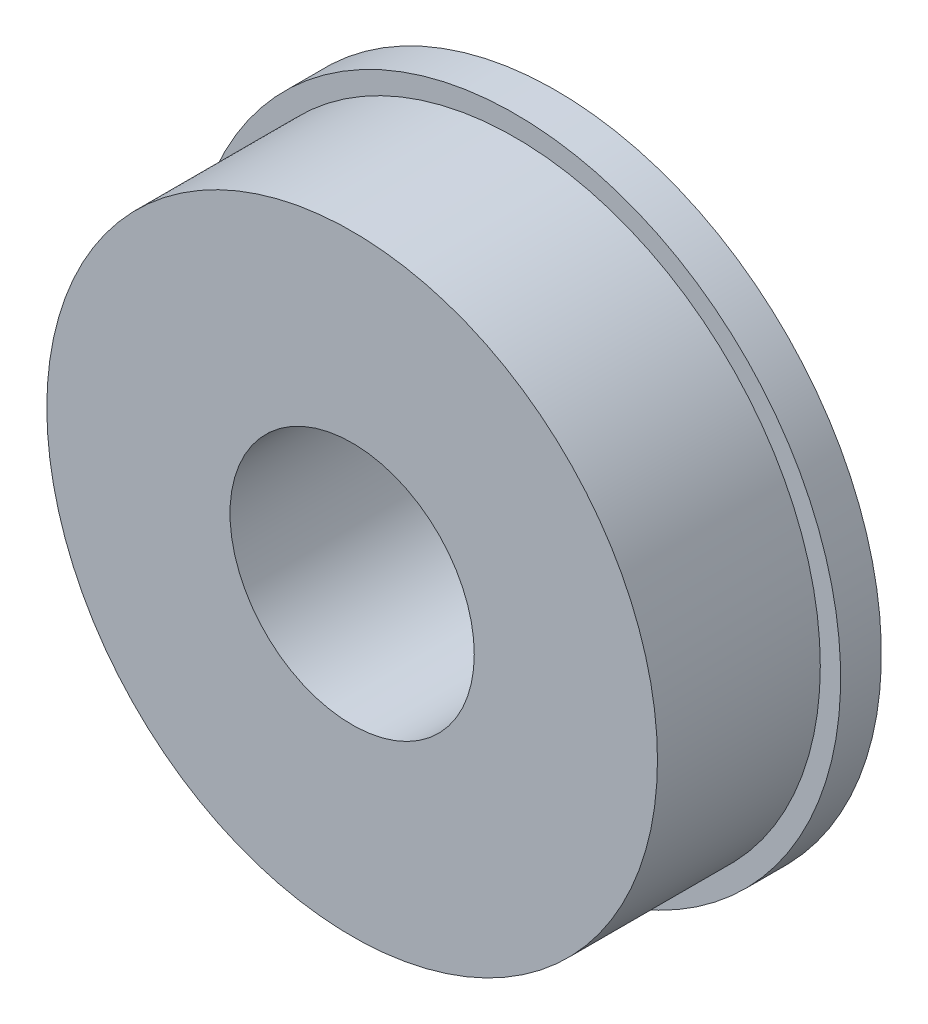
ISO-10303-21;
HEADER;
FILE_DESCRIPTION(('STEP AP214'),'2;1');
FILE_NAME('part.step','',(''),(''),'','','');
FILE_SCHEMA(('AUTOMOTIVE_DESIGN { 1 0 10303 214 1 1 1 1 }'));
ENDSEC;
DATA;
#1=APPLICATION_CONTEXT('core data for automotive mechanical design processes');
#2=APPLICATION_PROTOCOL_DEFINITION('international standard','automotive_design',2000,#1);
#3=PRODUCT_CONTEXT('',#1,'mechanical');
#4=PRODUCT('Part','Part','',(#3));
#5=PRODUCT_RELATED_PRODUCT_CATEGORY('part','',(#4));
#6=PRODUCT_DEFINITION_FORMATION('','',#4);
#7=PRODUCT_DEFINITION_CONTEXT('part definition',#1,'design');
#8=PRODUCT_DEFINITION('design','',#6,#7);
#9=PRODUCT_DEFINITION_SHAPE('','',#8);
#10=(LENGTH_UNIT() NAMED_UNIT(*) SI_UNIT(.MILLI.,.METRE.));
#11=(NAMED_UNIT(*) PLANE_ANGLE_UNIT() SI_UNIT($,.RADIAN.));
#12=(NAMED_UNIT(*) SI_UNIT($,.STERADIAN.) SOLID_ANGLE_UNIT());
#13=UNCERTAINTY_MEASURE_WITH_UNIT(LENGTH_MEASURE(1.E-05),#10,'distance_accuracy_value','');
#14=(GEOMETRIC_REPRESENTATION_CONTEXT(3) GLOBAL_UNCERTAINTY_ASSIGNED_CONTEXT((#13)) GLOBAL_UNIT_ASSIGNED_CONTEXT((#10,
#11,#12)) REPRESENTATION_CONTEXT('',''));
#15=CARTESIAN_POINT('',(0.,0.,0.));
#16=DIRECTION('',(0.,0.,1.));
#17=DIRECTION('',(1.,0.,0.));
#18=AXIS2_PLACEMENT_3D('',#15,#16,#17);
#19=CARTESIAN_POINT('',(0.,0.,5.));
#20=DIRECTION('',(0.,0.,-1.));
#21=DIRECTION('',(-1.,0.,0.));
#22=AXIS2_PLACEMENT_3D('',#19,#20,#21);
#23=CYLINDRICAL_SURFACE('',#22,7.5);
#24=CARTESIAN_POINT('',(0.,0.,5.));
#25=DIRECTION('',(0.,0.,1.));
#26=DIRECTION('',(1.,0.,0.));
#27=AXIS2_PLACEMENT_3D('',#24,#25,#26);
#28=CIRCLE('',#27,7.5);
#29=CARTESIAN_POINT('',(7.5,0.,5.));
#30=VERTEX_POINT('',#29);
#31=EDGE_CURVE('E45',#30,#30,#28,.T.);
#32=ORIENTED_EDGE('',*,*,#31,.F.);
#33=EDGE_LOOP('',(#32));
#34=FACE_BOUND('',#33,.T.);
#35=CARTESIAN_POINT('',(0.,0.,1.));
#36=DIRECTION('',(0.,0.,-1.));
#37=DIRECTION('',(-1.,0.,0.));
#38=AXIS2_PLACEMENT_3D('',#35,#36,#37);
#39=CIRCLE('',#38,7.5);
#40=CARTESIAN_POINT('',(-7.5,0.,1.));
#41=VERTEX_POINT('',#40);
#42=EDGE_CURVE('E10',#41,#41,#39,.T.);
#43=ORIENTED_EDGE('',*,*,#42,.F.);
#44=EDGE_LOOP('',(#43));
#45=FACE_BOUND('',#44,.T.);
#46=ADVANCED_FACE('F39',(#34,#45),#23,.T.);
#47=CARTESIAN_POINT('',(0.,0.,5.));
#48=DIRECTION('',(0.,0.,1.));
#49=DIRECTION('',(1.,0.,0.));
#50=AXIS2_PLACEMENT_3D('',#47,#48,#49);
#51=PLANE('',#50);
#52=ORIENTED_EDGE('',*,*,#31,.T.);
#53=EDGE_LOOP('',(#52));
#54=FACE_BOUND('',#53,.T.);
#55=CARTESIAN_POINT('',(0.,0.,5.));
#56=DIRECTION('',(0.,0.,1.));
#57=DIRECTION('',(1.,0.,0.));
#58=AXIS2_PLACEMENT_3D('',#55,#56,#57);
#59=CIRCLE('',#58,3.);
#60=CARTESIAN_POINT('',(3.,0.,5.));
#61=VERTEX_POINT('',#60);
#62=EDGE_CURVE('E49',#61,#61,#59,.T.);
#63=ORIENTED_EDGE('',*,*,#62,.F.);
#64=EDGE_LOOP('',(#63));
#65=FACE_BOUND('',#64,.T.);
#66=ADVANCED_FACE('F77',(#54,#65),#51,.T.);
#67=CARTESIAN_POINT('',(0.,0.,0.));
#68=DIRECTION('',(0.,0.,1.));
#69=DIRECTION('',(1.,0.,0.));
#70=AXIS2_PLACEMENT_3D('',#67,#68,#69);
#71=PLANE('',#70);
#72=CARTESIAN_POINT('',(0.,0.,0.));
#73=DIRECTION('',(0.,0.,1.));
#74=DIRECTION('',(1.,0.,0.));
#75=AXIS2_PLACEMENT_3D('',#72,#73,#74);
#76=CIRCLE('',#75,3.);
#77=CARTESIAN_POINT('',(3.,0.,0.));
#78=VERTEX_POINT('',#77);
#79=EDGE_CURVE('E53',#78,#78,#76,.T.);
#80=ORIENTED_EDGE('',*,*,#79,.T.);
#81=EDGE_LOOP('',(#80));
#82=FACE_BOUND('',#81,.T.);
#83=CARTESIAN_POINT('',(0.,0.,0.));
#84=DIRECTION('',(0.,0.,-1.));
#85=DIRECTION('',(-1.,0.,0.));
#86=AXIS2_PLACEMENT_3D('',#83,#84,#85);
#87=CIRCLE('',#86,8.);
#88=CARTESIAN_POINT('',(-8.,0.,0.));
#89=VERTEX_POINT('',#88);
#90=EDGE_CURVE('E59',#89,#89,#87,.T.);
#91=ORIENTED_EDGE('',*,*,#90,.T.);
#92=EDGE_LOOP('',(#91));
#93=FACE_BOUND('',#92,.T.);
#94=ADVANCED_FACE('F84',(#82,#93),#71,.F.);
#95=CARTESIAN_POINT('',(0.,0.,5.));
#96=DIRECTION('',(0.,0.,-1.));
#97=DIRECTION('',(-1.,0.,0.));
#98=AXIS2_PLACEMENT_3D('',#95,#96,#97);
#99=CYLINDRICAL_SURFACE('',#98,3.);
#100=ORIENTED_EDGE('',*,*,#62,.T.);
#101=EDGE_LOOP('',(#100));
#102=FACE_BOUND('',#101,.T.);
#103=ORIENTED_EDGE('',*,*,#79,.F.);
#104=EDGE_LOOP('',(#103));
#105=FACE_BOUND('',#104,.T.);
#106=ADVANCED_FACE('F74',(#102,#105),#99,.F.);
#107=CARTESIAN_POINT('',(0.,0.,1.));
#108=DIRECTION('',(0.,0.,-1.));
#109=DIRECTION('',(-1.,0.,0.));
#110=AXIS2_PLACEMENT_3D('',#107,#108,#109);
#111=CYLINDRICAL_SURFACE('',#110,8.);
#112=CARTESIAN_POINT('',(0.,0.,1.));
#113=DIRECTION('',(0.,0.,-1.));
#114=DIRECTION('',(-1.,0.,0.));
#115=AXIS2_PLACEMENT_3D('',#112,#113,#114);
#116=CIRCLE('',#115,8.);
#117=CARTESIAN_POINT('',(-8.,0.,1.));
#118=VERTEX_POINT('',#117);
#119=EDGE_CURVE('E57',#118,#118,#116,.T.);
#120=ORIENTED_EDGE('',*,*,#119,.T.);
#121=EDGE_LOOP('',(#120));
#122=FACE_BOUND('',#121,.T.);
#123=ORIENTED_EDGE('',*,*,#90,.F.);
#124=EDGE_LOOP('',(#123));
#125=FACE_BOUND('',#124,.T.);
#126=ADVANCED_FACE('F65',(#122,#125),#111,.T.);
#127=CARTESIAN_POINT('',(0.,0.,1.));
#128=DIRECTION('',(0.,0.,-1.));
#129=DIRECTION('',(-1.,0.,0.));
#130=AXIS2_PLACEMENT_3D('',#127,#128,#129);
#131=PLANE('',#130);
#132=ORIENTED_EDGE('',*,*,#42,.T.);
#133=EDGE_LOOP('',(#132));
#134=FACE_BOUND('',#133,.T.);
#135=ORIENTED_EDGE('',*,*,#119,.F.);
#136=EDGE_LOOP('',(#135));
#137=FACE_BOUND('',#136,.T.);
#138=ADVANCED_FACE('F68',(#134,#137),#131,.F.);
#139=CLOSED_SHELL('',(#46,#66,#94,#106,#126,#138));
#140=MANIFOLD_SOLID_BREP('B2',#139);
#141=ADVANCED_BREP_SHAPE_REPRESENTATION('',(#18,#140),#14);
#142=SHAPE_DEFINITION_REPRESENTATION(#9,#141);
ENDSEC;
END-ISO-10303-21;
